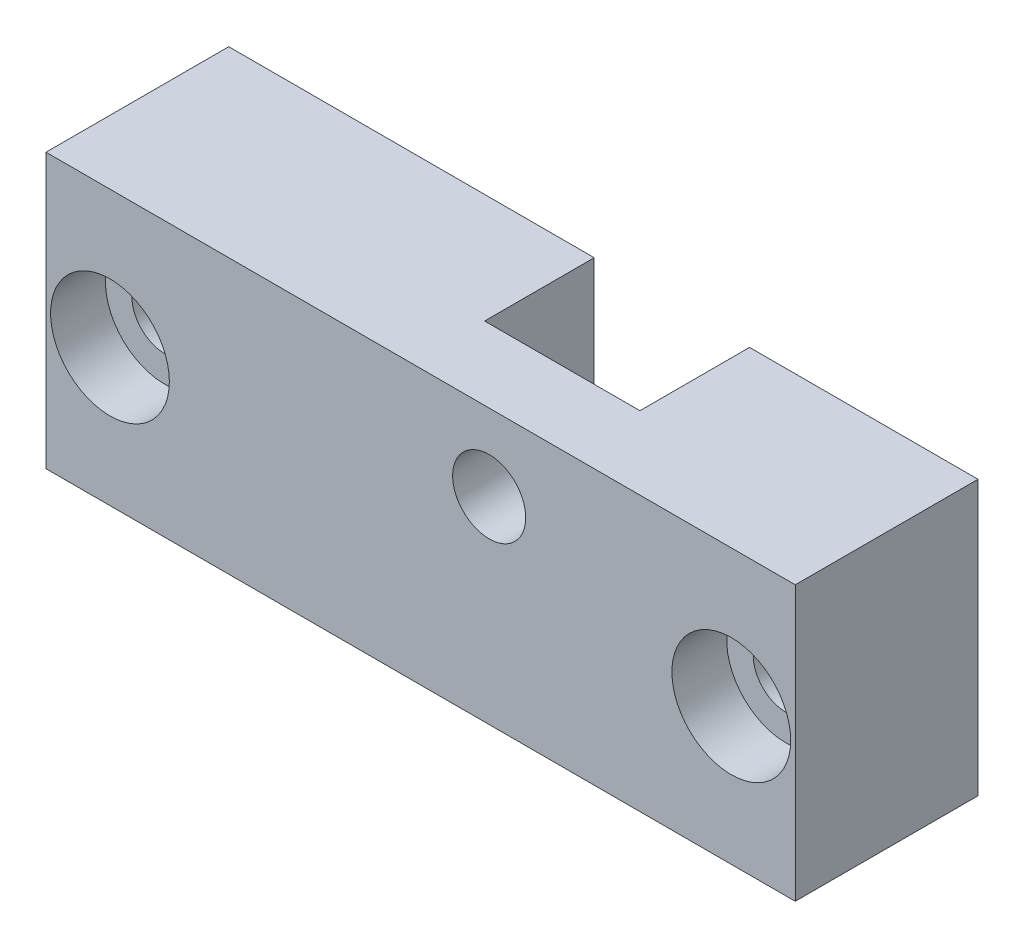
ISO-10303-21;
HEADER;
FILE_DESCRIPTION(('STEP AP214'),'2;1');
FILE_NAME('part.step','',(''),(''),'','','');
FILE_SCHEMA(('AUTOMOTIVE_DESIGN { 1 0 10303 214 1 1 1 1 }'));
ENDSEC;
DATA;
#1=APPLICATION_CONTEXT('core data for automotive mechanical design processes');
#2=APPLICATION_PROTOCOL_DEFINITION('international standard','automotive_design',2000,#1);
#3=PRODUCT_CONTEXT('',#1,'mechanical');
#4=PRODUCT('Part','Part','',(#3));
#5=PRODUCT_RELATED_PRODUCT_CATEGORY('part','',(#4));
#6=PRODUCT_DEFINITION_FORMATION('','',#4);
#7=PRODUCT_DEFINITION_CONTEXT('part definition',#1,'design');
#8=PRODUCT_DEFINITION('design','',#6,#7);
#9=PRODUCT_DEFINITION_SHAPE('','',#8);
#10=(LENGTH_UNIT() NAMED_UNIT(*) SI_UNIT(.MILLI.,.METRE.));
#11=(NAMED_UNIT(*) PLANE_ANGLE_UNIT() SI_UNIT($,.RADIAN.));
#12=(NAMED_UNIT(*) SI_UNIT($,.STERADIAN.) SOLID_ANGLE_UNIT());
#13=UNCERTAINTY_MEASURE_WITH_UNIT(LENGTH_MEASURE(1.E-05),#10,'distance_accuracy_value','');
#14=(GEOMETRIC_REPRESENTATION_CONTEXT(3) GLOBAL_UNCERTAINTY_ASSIGNED_CONTEXT((#13)) GLOBAL_UNIT_ASSIGNED_CONTEXT((#10,
#11,#12)) REPRESENTATION_CONTEXT('',''));
#15=CARTESIAN_POINT('',(0.,0.,0.));
#16=DIRECTION('',(0.,0.,1.));
#17=DIRECTION('',(1.,0.,0.));
#18=AXIS2_PLACEMENT_3D('',#15,#16,#17);
#19=CARTESIAN_POINT('',(0.,15.,0.));
#20=DIRECTION('',(0.,0.,-1.));
#21=DIRECTION('',(-1.,0.,0.));
#22=AXIS2_PLACEMENT_3D('',#19,#20,#21);
#23=PLANE('',#22);
#24=DIRECTION('',(0.,1.,0.));
#25=VECTOR('',#24,1.);
#26=CARTESIAN_POINT('',(20.,0.,0.));
#27=LINE('',#26,#25);
#28=CARTESIAN_POINT('',(20.,0.,0.));
#29=VERTEX_POINT('',#28);
#30=CARTESIAN_POINT('',(20.,15.,0.));
#31=VERTEX_POINT('',#30);
#32=EDGE_CURVE('E138',#29,#31,#27,.T.);
#33=ORIENTED_EDGE('',*,*,#32,.F.);
#34=DIRECTION('',(1.,0.,0.));
#35=VECTOR('',#34,1.);
#36=CARTESIAN_POINT('',(0.,0.,0.));
#37=LINE('',#36,#35);
#38=CARTESIAN_POINT('',(0.,0.,0.));
#39=VERTEX_POINT('',#38);
#40=EDGE_CURVE('E127',#39,#29,#37,.T.);
#41=ORIENTED_EDGE('',*,*,#40,.F.);
#42=DIRECTION('',(0.,-1.,0.));
#43=VECTOR('',#42,1.);
#44=CARTESIAN_POINT('',(0.,0.,0.));
#45=LINE('',#44,#43);
#46=CARTESIAN_POINT('',(0.,15.,0.));
#47=VERTEX_POINT('',#46);
#48=EDGE_CURVE('E167',#47,#39,#45,.T.);
#49=ORIENTED_EDGE('',*,*,#48,.F.);
#50=DIRECTION('',(-1.,0.,0.));
#51=VECTOR('',#50,1.);
#52=CARTESIAN_POINT('',(0.,15.,0.));
#53=LINE('',#52,#51);
#54=EDGE_CURVE('E78',#31,#47,#53,.T.);
#55=ORIENTED_EDGE('',*,*,#54,.F.);
#56=EDGE_LOOP('',(#33,#41,#49,#55));
#57=FACE_BOUND('',#56,.T.);
#58=CARTESIAN_POINT('',(3.5,7.5,0.));
#59=DIRECTION('',(0.,0.,1.));
#60=DIRECTION('',(1.,0.,0.));
#61=AXIS2_PLACEMENT_3D('',#58,#59,#60);
#62=CIRCLE('',#61,1.8);
#63=CARTESIAN_POINT('',(5.3,7.5,0.));
#64=VERTEX_POINT('',#63);
#65=EDGE_CURVE('E152',#64,#64,#62,.T.);
#66=ORIENTED_EDGE('',*,*,#65,.T.);
#67=EDGE_LOOP('',(#66));
#68=FACE_BOUND('',#67,.T.);
#69=ADVANCED_FACE('F33',(#57,#68),#23,.T.);
#70=CARTESIAN_POINT('',(0.,0.,10.));
#71=DIRECTION('',(1.,0.,0.));
#72=DIRECTION('',(0.,0.,-1.));
#73=AXIS2_PLACEMENT_3D('',#70,#71,#72);
#74=PLANE('',#73);
#75=ORIENTED_EDGE('',*,*,#48,.T.);
#76=DIRECTION('',(0.,0.,-1.));
#77=VECTOR('',#76,1.);
#78=CARTESIAN_POINT('',(0.,0.,10.));
#79=LINE('',#78,#77);
#80=CARTESIAN_POINT('',(0.,0.,10.));
#81=VERTEX_POINT('',#80);
#82=EDGE_CURVE('E11',#81,#39,#79,.T.);
#83=ORIENTED_EDGE('',*,*,#82,.F.);
#84=DIRECTION('',(0.,-1.,0.));
#85=VECTOR('',#84,1.);
#86=CARTESIAN_POINT('',(0.,0.,10.));
#87=LINE('',#86,#85);
#88=CARTESIAN_POINT('',(0.,15.,10.));
#89=VERTEX_POINT('',#88);
#90=EDGE_CURVE('E168',#89,#81,#87,.T.);
#91=ORIENTED_EDGE('',*,*,#90,.F.);
#92=DIRECTION('',(0.,0.,-1.));
#93=VECTOR('',#92,1.);
#94=CARTESIAN_POINT('',(0.,15.,10.));
#95=LINE('',#94,#93);
#96=EDGE_CURVE('E175',#89,#47,#95,.T.);
#97=ORIENTED_EDGE('',*,*,#96,.T.);
#98=EDGE_LOOP('',(#75,#83,#91,#97));
#99=FACE_BOUND('',#98,.T.);
#100=ADVANCED_FACE('F35',(#99),#74,.F.);
#101=CARTESIAN_POINT('',(0.,0.,10.));
#102=DIRECTION('',(0.,1.,0.));
#103=DIRECTION('',(0.,0.,1.));
#104=AXIS2_PLACEMENT_3D('',#101,#102,#103);
#105=PLANE('',#104);
#106=ORIENTED_EDGE('',*,*,#40,.T.);
#107=DIRECTION('',(0.,0.,1.));
#108=VECTOR('',#107,1.);
#109=CARTESIAN_POINT('',(20.,0.,0.));
#110=LINE('',#109,#108);
#111=CARTESIAN_POINT('',(20.,0.,6.));
#112=VERTEX_POINT('',#111);
#113=EDGE_CURVE('E110',#29,#112,#110,.T.);
#114=ORIENTED_EDGE('',*,*,#113,.T.);
#115=DIRECTION('',(1.,0.,0.));
#116=VECTOR('',#115,1.);
#117=CARTESIAN_POINT('',(20.,0.,6.));
#118=LINE('',#117,#116);
#119=CARTESIAN_POINT('',(28.5,0.,6.));
#120=VERTEX_POINT('',#119);
#121=EDGE_CURVE('E120',#112,#120,#118,.T.);
#122=ORIENTED_EDGE('',*,*,#121,.T.);
#123=DIRECTION('',(0.,0.,-1.));
#124=VECTOR('',#123,1.);
#125=CARTESIAN_POINT('',(28.5,0.,0.));
#126=LINE('',#125,#124);
#127=CARTESIAN_POINT('',(28.5,0.,0.));
#128=VERTEX_POINT('',#127);
#129=EDGE_CURVE('E117',#120,#128,#126,.T.);
#130=ORIENTED_EDGE('',*,*,#129,.T.);
#131=CARTESIAN_POINT('',(41.,0.,0.));
#132=VERTEX_POINT('',#131);
#133=EDGE_CURVE('E178',#128,#132,#37,.T.);
#134=ORIENTED_EDGE('',*,*,#133,.T.);
#135=DIRECTION('',(0.,0.,-1.));
#136=VECTOR('',#135,1.);
#137=CARTESIAN_POINT('',(41.,0.,10.));
#138=LINE('',#137,#136);
#139=CARTESIAN_POINT('',(41.,0.,10.));
#140=VERTEX_POINT('',#139);
#141=EDGE_CURVE('E41',#140,#132,#138,.T.);
#142=ORIENTED_EDGE('',*,*,#141,.F.);
#143=DIRECTION('',(1.,0.,0.));
#144=VECTOR('',#143,1.);
#145=CARTESIAN_POINT('',(0.,0.,10.));
#146=LINE('',#145,#144);
#147=EDGE_CURVE('E85',#81,#140,#146,.T.);
#148=ORIENTED_EDGE('',*,*,#147,.F.);
#149=ORIENTED_EDGE('',*,*,#82,.T.);
#150=EDGE_LOOP('',(#106,#114,#122,#130,#134,#142,#148,#149));
#151=FACE_BOUND('',#150,.T.);
#152=ADVANCED_FACE('F126',(#151),#105,.F.);
#153=CARTESIAN_POINT('',(41.,0.,10.));
#154=DIRECTION('',(-1.,0.,0.));
#155=DIRECTION('',(0.,0.,1.));
#156=AXIS2_PLACEMENT_3D('',#153,#154,#155);
#157=PLANE('',#156);
#158=DIRECTION('',(0.,1.,0.));
#159=VECTOR('',#158,1.);
#160=CARTESIAN_POINT('',(41.,0.,0.));
#161=LINE('',#160,#159);
#162=CARTESIAN_POINT('',(41.,15.,0.));
#163=VERTEX_POINT('',#162);
#164=EDGE_CURVE('E180',#132,#163,#161,.T.);
#165=ORIENTED_EDGE('',*,*,#164,.T.);
#166=DIRECTION('',(0.,0.,-1.));
#167=VECTOR('',#166,1.);
#168=CARTESIAN_POINT('',(41.,15.,10.));
#169=LINE('',#168,#167);
#170=CARTESIAN_POINT('',(41.,15.,10.));
#171=VERTEX_POINT('',#170);
#172=EDGE_CURVE('E185',#171,#163,#169,.T.);
#173=ORIENTED_EDGE('',*,*,#172,.F.);
#174=DIRECTION('',(0.,1.,0.));
#175=VECTOR('',#174,1.);
#176=CARTESIAN_POINT('',(41.,0.,10.));
#177=LINE('',#176,#175);
#178=EDGE_CURVE('E172',#140,#171,#177,.T.);
#179=ORIENTED_EDGE('',*,*,#178,.F.);
#180=ORIENTED_EDGE('',*,*,#141,.T.);
#181=EDGE_LOOP('',(#165,#173,#179,#180));
#182=FACE_BOUND('',#181,.T.);
#183=ADVANCED_FACE('F191',(#182),#157,.F.);
#184=CARTESIAN_POINT('',(0.,15.,10.));
#185=DIRECTION('',(0.,-1.,0.));
#186=DIRECTION('',(0.,0.,-1.));
#187=AXIS2_PLACEMENT_3D('',#184,#185,#186);
#188=PLANE('',#187);
#189=DIRECTION('',(1.,0.,0.));
#190=VECTOR('',#189,1.);
#191=CARTESIAN_POINT('',(20.,15.,6.));
#192=LINE('',#191,#190);
#193=CARTESIAN_POINT('',(20.,15.,6.));
#194=VERTEX_POINT('',#193);
#195=CARTESIAN_POINT('',(28.5,15.,6.));
#196=VERTEX_POINT('',#195);
#197=EDGE_CURVE('E129',#194,#196,#192,.T.);
#198=ORIENTED_EDGE('',*,*,#197,.F.);
#199=DIRECTION('',(0.,0.,1.));
#200=VECTOR('',#199,1.);
#201=CARTESIAN_POINT('',(20.,15.,0.));
#202=LINE('',#201,#200);
#203=EDGE_CURVE('E112',#31,#194,#202,.T.);
#204=ORIENTED_EDGE('',*,*,#203,.F.);
#205=ORIENTED_EDGE('',*,*,#54,.T.);
#206=ORIENTED_EDGE('',*,*,#96,.F.);
#207=DIRECTION('',(-1.,0.,0.));
#208=VECTOR('',#207,1.);
#209=CARTESIAN_POINT('',(0.,15.,10.));
#210=LINE('',#209,#208);
#211=EDGE_CURVE('E57',#171,#89,#210,.T.);
#212=ORIENTED_EDGE('',*,*,#211,.F.);
#213=ORIENTED_EDGE('',*,*,#172,.T.);
#214=CARTESIAN_POINT('',(28.5,15.,0.));
#215=VERTEX_POINT('',#214);
#216=EDGE_CURVE('E170',#163,#215,#53,.T.);
#217=ORIENTED_EDGE('',*,*,#216,.T.);
#218=DIRECTION('',(0.,0.,-1.));
#219=VECTOR('',#218,1.);
#220=CARTESIAN_POINT('',(28.5,15.,0.));
#221=LINE('',#220,#219);
#222=EDGE_CURVE('E48',#196,#215,#221,.T.);
#223=ORIENTED_EDGE('',*,*,#222,.F.);
#224=EDGE_LOOP('',(#198,#204,#205,#206,#212,#213,#217,#223));
#225=FACE_BOUND('',#224,.T.);
#226=ADVANCED_FACE('F198',(#225),#188,.F.);
#227=CARTESIAN_POINT('',(0.,15.,10.));
#228=DIRECTION('',(0.,0.,-1.));
#229=DIRECTION('',(-1.,0.,0.));
#230=AXIS2_PLACEMENT_3D('',#227,#228,#229);
#231=PLANE('',#230);
#232=CARTESIAN_POINT('',(24.25,10.8,10.));
#233=DIRECTION('',(0.,0.,-1.));
#234=DIRECTION('',(-1.,0.,0.));
#235=AXIS2_PLACEMENT_3D('',#232,#233,#234);
#236=CIRCLE('',#235,2.);
#237=CARTESIAN_POINT('',(22.25,10.8,10.));
#238=VERTEX_POINT('',#237);
#239=EDGE_CURVE('E132',#238,#238,#236,.T.);
#240=ORIENTED_EDGE('',*,*,#239,.T.);
#241=EDGE_LOOP('',(#240));
#242=FACE_BOUND('',#241,.T.);
#243=CARTESIAN_POINT('',(3.5,7.5,10.));
#244=DIRECTION('',(0.,0.,1.));
#245=DIRECTION('',(1.,0.,0.));
#246=AXIS2_PLACEMENT_3D('',#243,#244,#245);
#247=CIRCLE('',#246,3.25);
#248=CARTESIAN_POINT('',(6.75,7.5,10.));
#249=VERTEX_POINT('',#248);
#250=EDGE_CURVE('E140',#249,#249,#247,.T.);
#251=ORIENTED_EDGE('',*,*,#250,.F.);
#252=EDGE_LOOP('',(#251));
#253=FACE_BOUND('',#252,.T.);
#254=CARTESIAN_POINT('',(37.5,7.5,10.));
#255=DIRECTION('',(0.,0.,1.));
#256=DIRECTION('',(1.,0.,0.));
#257=AXIS2_PLACEMENT_3D('',#254,#255,#256);
#258=CIRCLE('',#257,3.25);
#259=CARTESIAN_POINT('',(40.75,7.5,10.));
#260=VERTEX_POINT('',#259);
#261=EDGE_CURVE('E155',#260,#260,#258,.T.);
#262=ORIENTED_EDGE('',*,*,#261,.F.);
#263=EDGE_LOOP('',(#262));
#264=FACE_BOUND('',#263,.T.);
#265=ORIENTED_EDGE('',*,*,#90,.T.);
#266=ORIENTED_EDGE('',*,*,#147,.T.);
#267=ORIENTED_EDGE('',*,*,#178,.T.);
#268=ORIENTED_EDGE('',*,*,#211,.T.);
#269=EDGE_LOOP('',(#265,#266,#267,#268));
#270=FACE_BOUND('',#269,.T.);
#271=ADVANCED_FACE('F203',(#242,#253,#264,#270),#231,.F.);
#272=DIRECTION('',(0.,1.,0.));
#273=VECTOR('',#272,1.);
#274=CARTESIAN_POINT('',(28.5,0.,0.));
#275=LINE('',#274,#273);
#276=EDGE_CURVE('E141',#128,#215,#275,.T.);
#277=ORIENTED_EDGE('',*,*,#276,.T.);
#278=ORIENTED_EDGE('',*,*,#216,.F.);
#279=ORIENTED_EDGE('',*,*,#164,.F.);
#280=ORIENTED_EDGE('',*,*,#133,.F.);
#281=EDGE_LOOP('',(#277,#278,#279,#280));
#282=FACE_BOUND('',#281,.T.);
#283=CARTESIAN_POINT('',(37.5,7.5,0.));
#284=DIRECTION('',(0.,0.,1.));
#285=DIRECTION('',(1.,0.,0.));
#286=AXIS2_PLACEMENT_3D('',#283,#284,#285);
#287=CIRCLE('',#286,1.8);
#288=CARTESIAN_POINT('',(39.3,7.5,0.));
#289=VERTEX_POINT('',#288);
#290=EDGE_CURVE('E164',#289,#289,#287,.T.);
#291=ORIENTED_EDGE('',*,*,#290,.T.);
#292=EDGE_LOOP('',(#291));
#293=FACE_BOUND('',#292,.T.);
#294=ADVANCED_FACE('F196',(#282,#293),#23,.T.);
#295=CARTESIAN_POINT('',(37.5,7.5,10.));
#296=DIRECTION('',(0.,0.,1.));
#297=DIRECTION('',(1.,0.,0.));
#298=AXIS2_PLACEMENT_3D('',#295,#296,#297);
#299=CYLINDRICAL_SURFACE('',#298,1.8);
#300=ORIENTED_EDGE('',*,*,#290,.F.);
#301=EDGE_LOOP('',(#300));
#302=FACE_BOUND('',#301,.T.);
#303=CARTESIAN_POINT('',(37.5,7.5,7.));
#304=DIRECTION('',(0.,0.,1.));
#305=DIRECTION('',(1.,0.,0.));
#306=AXIS2_PLACEMENT_3D('',#303,#304,#305);
#307=CIRCLE('',#306,1.8);
#308=CARTESIAN_POINT('',(39.3,7.5,7.));
#309=VERTEX_POINT('',#308);
#310=EDGE_CURVE('E161',#309,#309,#307,.T.);
#311=ORIENTED_EDGE('',*,*,#310,.T.);
#312=EDGE_LOOP('',(#311));
#313=FACE_BOUND('',#312,.T.);
#314=ADVANCED_FACE('F211',(#302,#313),#299,.F.);
#315=CARTESIAN_POINT('',(39.3,7.5,7.));
#316=DIRECTION('',(0.,0.,-1.));
#317=DIRECTION('',(-1.,0.,0.));
#318=AXIS2_PLACEMENT_3D('',#315,#316,#317);
#319=PLANE('',#318);
#320=ORIENTED_EDGE('',*,*,#310,.F.);
#321=EDGE_LOOP('',(#320));
#322=FACE_BOUND('',#321,.T.);
#323=CARTESIAN_POINT('',(37.5,7.5,7.));
#324=DIRECTION('',(0.,0.,1.));
#325=DIRECTION('',(1.,0.,0.));
#326=AXIS2_PLACEMENT_3D('',#323,#324,#325);
#327=CIRCLE('',#326,3.25);
#328=CARTESIAN_POINT('',(40.75,7.5,7.));
#329=VERTEX_POINT('',#328);
#330=EDGE_CURVE('E158',#329,#329,#327,.T.);
#331=ORIENTED_EDGE('',*,*,#330,.T.);
#332=EDGE_LOOP('',(#331));
#333=FACE_BOUND('',#332,.T.);
#334=ADVANCED_FACE('F310',(#322,#333),#319,.F.);
#335=CARTESIAN_POINT('',(37.5,7.5,10.));
#336=DIRECTION('',(0.,0.,1.));
#337=DIRECTION('',(1.,0.,0.));
#338=AXIS2_PLACEMENT_3D('',#335,#336,#337);
#339=CYLINDRICAL_SURFACE('',#338,3.25);
#340=ORIENTED_EDGE('',*,*,#330,.F.);
#341=EDGE_LOOP('',(#340));
#342=FACE_BOUND('',#341,.T.);
#343=ORIENTED_EDGE('',*,*,#261,.T.);
#344=EDGE_LOOP('',(#343));
#345=FACE_BOUND('',#344,.T.);
#346=ADVANCED_FACE('F306',(#342,#345),#339,.F.);
#347=CARTESIAN_POINT('',(3.5,7.5,10.));
#348=DIRECTION('',(0.,0.,1.));
#349=DIRECTION('',(1.,0.,0.));
#350=AXIS2_PLACEMENT_3D('',#347,#348,#349);
#351=CYLINDRICAL_SURFACE('',#350,1.8);
#352=ORIENTED_EDGE('',*,*,#65,.F.);
#353=EDGE_LOOP('',(#352));
#354=FACE_BOUND('',#353,.T.);
#355=CARTESIAN_POINT('',(3.5,7.5,7.));
#356=DIRECTION('',(0.,0.,1.));
#357=DIRECTION('',(1.,0.,0.));
#358=AXIS2_PLACEMENT_3D('',#355,#356,#357);
#359=CIRCLE('',#358,1.8);
#360=CARTESIAN_POINT('',(5.3,7.5,7.));
#361=VERTEX_POINT('',#360);
#362=EDGE_CURVE('E149',#361,#361,#359,.T.);
#363=ORIENTED_EDGE('',*,*,#362,.T.);
#364=EDGE_LOOP('',(#363));
#365=FACE_BOUND('',#364,.T.);
#366=ADVANCED_FACE('F302',(#354,#365),#351,.F.);
#367=CARTESIAN_POINT('',(5.3,7.5,7.));
#368=DIRECTION('',(0.,0.,-1.));
#369=DIRECTION('',(-1.,0.,0.));
#370=AXIS2_PLACEMENT_3D('',#367,#368,#369);
#371=PLANE('',#370);
#372=ORIENTED_EDGE('',*,*,#362,.F.);
#373=EDGE_LOOP('',(#372));
#374=FACE_BOUND('',#373,.T.);
#375=CARTESIAN_POINT('',(3.5,7.5,7.));
#376=DIRECTION('',(0.,0.,1.));
#377=DIRECTION('',(1.,0.,0.));
#378=AXIS2_PLACEMENT_3D('',#375,#376,#377);
#379=CIRCLE('',#378,3.25);
#380=CARTESIAN_POINT('',(6.75,7.5,7.));
#381=VERTEX_POINT('',#380);
#382=EDGE_CURVE('E146',#381,#381,#379,.T.);
#383=ORIENTED_EDGE('',*,*,#382,.T.);
#384=EDGE_LOOP('',(#383));
#385=FACE_BOUND('',#384,.T.);
#386=ADVANCED_FACE('F298',(#374,#385),#371,.F.);
#387=CARTESIAN_POINT('',(3.5,7.5,10.));
#388=DIRECTION('',(0.,0.,1.));
#389=DIRECTION('',(1.,0.,0.));
#390=AXIS2_PLACEMENT_3D('',#387,#388,#389);
#391=CYLINDRICAL_SURFACE('',#390,3.25);
#392=ORIENTED_EDGE('',*,*,#382,.F.);
#393=EDGE_LOOP('',(#392));
#394=FACE_BOUND('',#393,.T.);
#395=ORIENTED_EDGE('',*,*,#250,.T.);
#396=EDGE_LOOP('',(#395));
#397=FACE_BOUND('',#396,.T.);
#398=ADVANCED_FACE('F258',(#394,#397),#391,.F.);
#399=CARTESIAN_POINT('',(20.,0.,0.));
#400=DIRECTION('',(-1.,0.,0.));
#401=DIRECTION('',(0.,0.,1.));
#402=AXIS2_PLACEMENT_3D('',#399,#400,#401);
#403=PLANE('',#402);
#404=ORIENTED_EDGE('',*,*,#203,.T.);
#405=DIRECTION('',(0.,1.,0.));
#406=VECTOR('',#405,1.);
#407=CARTESIAN_POINT('',(20.,0.,6.));
#408=LINE('',#407,#406);
#409=EDGE_CURVE('E106',#112,#194,#408,.T.);
#410=ORIENTED_EDGE('',*,*,#409,.F.);
#411=ORIENTED_EDGE('',*,*,#113,.F.);
#412=ORIENTED_EDGE('',*,*,#32,.T.);
#413=EDGE_LOOP('',(#404,#410,#411,#412));
#414=FACE_BOUND('',#413,.T.);
#415=ADVANCED_FACE('F108',(#414),#403,.F.);
#416=CARTESIAN_POINT('',(28.5,0.,0.));
#417=DIRECTION('',(1.,0.,0.));
#418=DIRECTION('',(0.,0.,-1.));
#419=AXIS2_PLACEMENT_3D('',#416,#417,#418);
#420=PLANE('',#419);
#421=ORIENTED_EDGE('',*,*,#222,.T.);
#422=ORIENTED_EDGE('',*,*,#276,.F.);
#423=ORIENTED_EDGE('',*,*,#129,.F.);
#424=DIRECTION('',(0.,1.,0.));
#425=VECTOR('',#424,1.);
#426=CARTESIAN_POINT('',(28.5,0.,6.));
#427=LINE('',#426,#425);
#428=EDGE_CURVE('E116',#120,#196,#427,.T.);
#429=ORIENTED_EDGE('',*,*,#428,.T.);
#430=EDGE_LOOP('',(#421,#422,#423,#429));
#431=FACE_BOUND('',#430,.T.);
#432=ADVANCED_FACE('F257',(#431),#420,.F.);
#433=CARTESIAN_POINT('',(20.,0.,6.));
#434=DIRECTION('',(0.,0.,1.));
#435=DIRECTION('',(1.,0.,0.));
#436=AXIS2_PLACEMENT_3D('',#433,#434,#435);
#437=PLANE('',#436);
#438=CARTESIAN_POINT('',(24.25,10.8,6.));
#439=DIRECTION('',(0.,0.,-1.));
#440=DIRECTION('',(-1.,0.,0.));
#441=AXIS2_PLACEMENT_3D('',#438,#439,#440);
#442=CIRCLE('',#441,2.);
#443=CARTESIAN_POINT('',(22.25,10.8,6.));
#444=VERTEX_POINT('',#443);
#445=EDGE_CURVE('E368',#444,#444,#442,.T.);
#446=ORIENTED_EDGE('',*,*,#445,.F.);
#447=EDGE_LOOP('',(#446));
#448=FACE_BOUND('',#447,.T.);
#449=ORIENTED_EDGE('',*,*,#197,.T.);
#450=ORIENTED_EDGE('',*,*,#428,.F.);
#451=ORIENTED_EDGE('',*,*,#121,.F.);
#452=ORIENTED_EDGE('',*,*,#409,.T.);
#453=EDGE_LOOP('',(#449,#450,#451,#452));
#454=FACE_BOUND('',#453,.T.);
#455=ADVANCED_FACE('F121',(#448,#454),#437,.F.);
#456=CARTESIAN_POINT('',(24.25,10.8,16.));
#457=DIRECTION('',(0.,0.,-1.));
#458=DIRECTION('',(-1.,0.,0.));
#459=AXIS2_PLACEMENT_3D('',#456,#457,#458);
#460=CYLINDRICAL_SURFACE('',#459,2.);
#461=ORIENTED_EDGE('',*,*,#445,.T.);
#462=EDGE_LOOP('',(#461));
#463=FACE_BOUND('',#462,.T.);
#464=ORIENTED_EDGE('',*,*,#239,.F.);
#465=EDGE_LOOP('',(#464));
#466=FACE_BOUND('',#465,.T.);
#467=ADVANCED_FACE('F280',(#463,#466),#460,.F.);
#468=CLOSED_SHELL('',(#69,#100,#152,#183,#226,#271,#294,#314,#334,#346,#366,#386,#398,#415,#432,
#455,#467));
#469=MANIFOLD_SOLID_BREP('B2',#468);
#470=ADVANCED_BREP_SHAPE_REPRESENTATION('',(#18,#469),#14);
#471=SHAPE_DEFINITION_REPRESENTATION(#9,#470);
ENDSEC;
END-ISO-10303-21;
